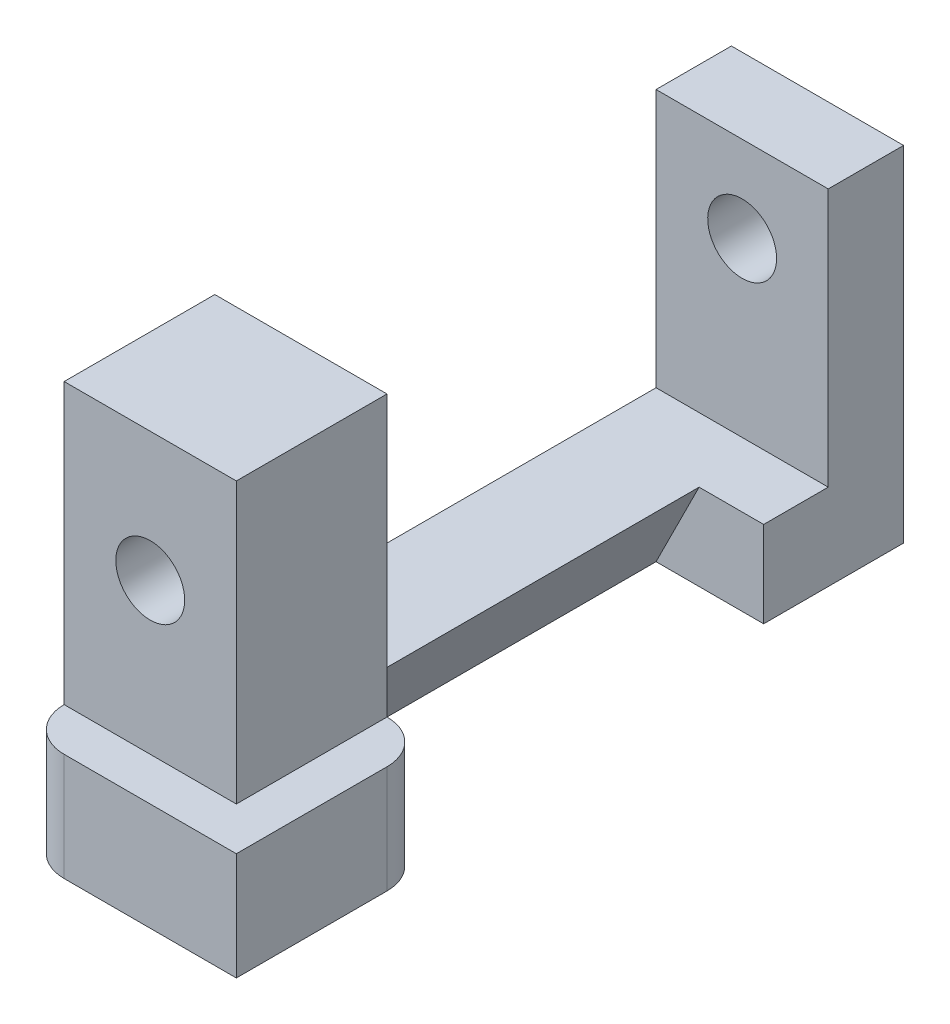
ISO-10303-21;
HEADER;
FILE_DESCRIPTION(('STEP AP214'),'2;1');
FILE_NAME('part.step','',(''),(''),'','','');
FILE_SCHEMA(('AUTOMOTIVE_DESIGN { 1 0 10303 214 1 1 1 1 }'));
ENDSEC;
DATA;
#1=APPLICATION_CONTEXT('core data for automotive mechanical design processes');
#2=APPLICATION_PROTOCOL_DEFINITION('international standard','automotive_design',2000,#1);
#3=PRODUCT_CONTEXT('',#1,'mechanical');
#4=PRODUCT('Part','Part','',(#3));
#5=PRODUCT_RELATED_PRODUCT_CATEGORY('part','',(#4));
#6=PRODUCT_DEFINITION_FORMATION('','',#4);
#7=PRODUCT_DEFINITION_CONTEXT('part definition',#1,'design');
#8=PRODUCT_DEFINITION('design','',#6,#7);
#9=PRODUCT_DEFINITION_SHAPE('','',#8);
#10=(LENGTH_UNIT() NAMED_UNIT(*) SI_UNIT(.MILLI.,.METRE.));
#11=(NAMED_UNIT(*) PLANE_ANGLE_UNIT() SI_UNIT($,.RADIAN.));
#12=(NAMED_UNIT(*) SI_UNIT($,.STERADIAN.) SOLID_ANGLE_UNIT());
#13=UNCERTAINTY_MEASURE_WITH_UNIT(LENGTH_MEASURE(1.E-05),#10,'distance_accuracy_value','');
#14=(GEOMETRIC_REPRESENTATION_CONTEXT(3) GLOBAL_UNCERTAINTY_ASSIGNED_CONTEXT((#13)) GLOBAL_UNIT_ASSIGNED_CONTEXT((#10,
#11,#12)) REPRESENTATION_CONTEXT('',''));
#15=CARTESIAN_POINT('',(0.,0.,0.));
#16=DIRECTION('',(0.,0.,1.));
#17=DIRECTION('',(1.,0.,0.));
#18=AXIS2_PLACEMENT_3D('',#15,#16,#17);
#19=CARTESIAN_POINT('',(-8.,18.,31.));
#20=DIRECTION('',(0.,0.,1.));
#21=DIRECTION('',(0.,-1.,0.));
#22=AXIS2_PLACEMENT_3D('',#19,#20,#21);
#23=PLANE('',#22);
#24=CARTESIAN_POINT('',(-12.,12.,31.));
#25=DIRECTION('',(0.,0.,1.));
#26=DIRECTION('',(1.,0.,0.));
#27=AXIS2_PLACEMENT_3D('',#24,#25,#26);
#28=CIRCLE('',#27,1.6);
#29=CARTESIAN_POINT('',(-10.4,12.,31.));
#30=VERTEX_POINT('',#29);
#31=EDGE_CURVE('E351',#30,#30,#28,.T.);
#32=ORIENTED_EDGE('',*,*,#31,.F.);
#33=EDGE_LOOP('',(#32));
#34=FACE_BOUND('',#33,.T.);
#35=DIRECTION('',(0.,-1.,0.));
#36=VECTOR('',#35,1.);
#37=CARTESIAN_POINT('',(-16.,18.,31.));
#38=LINE('',#37,#36);
#39=CARTESIAN_POINT('',(-16.,18.,31.));
#40=VERTEX_POINT('',#39);
#41=CARTESIAN_POINT('',(-16.,5.,31.));
#42=VERTEX_POINT('',#41);
#43=EDGE_CURVE('E167',#40,#42,#38,.T.);
#44=ORIENTED_EDGE('',*,*,#43,.T.);
#45=DIRECTION('',(1.,0.,0.));
#46=VECTOR('',#45,1.);
#47=CARTESIAN_POINT('',(-16.,5.,31.));
#48=LINE('',#47,#46);
#49=CARTESIAN_POINT('',(-8.,5.,31.));
#50=VERTEX_POINT('',#49);
#51=EDGE_CURVE('E140',#42,#50,#48,.T.);
#52=ORIENTED_EDGE('',*,*,#51,.T.);
#53=DIRECTION('',(0.,1.,0.));
#54=VECTOR('',#53,1.);
#55=CARTESIAN_POINT('',(-8.,18.,31.));
#56=LINE('',#55,#54);
#57=CARTESIAN_POINT('',(-8.,18.,31.));
#58=VERTEX_POINT('',#57);
#59=EDGE_CURVE('E247',#50,#58,#56,.T.);
#60=ORIENTED_EDGE('',*,*,#59,.T.);
#61=DIRECTION('',(1.,0.,0.));
#62=VECTOR('',#61,1.);
#63=CARTESIAN_POINT('',(-8.,18.,31.));
#64=LINE('',#63,#62);
#65=EDGE_CURVE('E41',#40,#58,#64,.T.);
#66=ORIENTED_EDGE('',*,*,#65,.F.);
#67=EDGE_LOOP('',(#44,#52,#60,#66));
#68=FACE_BOUND('',#67,.T.);
#69=ADVANCED_FACE('F33',(#34,#68),#23,.T.);
#70=CARTESIAN_POINT('',(-8.,0.,0.));
#71=DIRECTION('',(1.,0.,0.));
#72=DIRECTION('',(0.,0.,-1.));
#73=AXIS2_PLACEMENT_3D('',#70,#71,#72);
#74=PLANE('',#73);
#75=ORIENTED_EDGE('',*,*,#59,.F.);
#76=DIRECTION('',(0.,0.,-1.));
#77=VECTOR('',#76,1.);
#78=CARTESIAN_POINT('',(-8.,5.,31.));
#79=LINE('',#78,#77);
#80=CARTESIAN_POINT('',(-8.,5.,24.));
#81=VERTEX_POINT('',#80);
#82=EDGE_CURVE('E148',#50,#81,#79,.T.);
#83=ORIENTED_EDGE('',*,*,#82,.T.);
#84=DIRECTION('',(0.,-1.,0.));
#85=VECTOR('',#84,1.);
#86=CARTESIAN_POINT('',(-8.,4.,24.));
#87=LINE('',#86,#85);
#88=CARTESIAN_POINT('',(-8.,18.,24.));
#89=VERTEX_POINT('',#88);
#90=EDGE_CURVE('E241',#89,#81,#87,.T.);
#91=ORIENTED_EDGE('',*,*,#90,.F.);
#92=DIRECTION('',(0.,0.,-1.));
#93=VECTOR('',#92,1.);
#94=CARTESIAN_POINT('',(-8.,18.,24.));
#95=LINE('',#94,#93);
#96=EDGE_CURVE('E244',#58,#89,#95,.T.);
#97=ORIENTED_EDGE('',*,*,#96,.F.);
#98=EDGE_LOOP('',(#75,#83,#91,#97));
#99=FACE_BOUND('',#98,.T.);
#100=ADVANCED_FACE('F303',(#99),#74,.T.);
#101=CARTESIAN_POINT('',(-8.,16.,3.5));
#102=DIRECTION('',(0.,0.,1.));
#103=DIRECTION('',(0.,-1.,0.));
#104=AXIS2_PLACEMENT_3D('',#101,#102,#103);
#105=PLANE('',#104);
#106=CARTESIAN_POINT('',(-12.,12.,3.5));
#107=DIRECTION('',(0.,0.,1.));
#108=DIRECTION('',(0.,-1.,0.));
#109=AXIS2_PLACEMENT_3D('',#106,#107,#108);
#110=CIRCLE('',#109,1.6);
#111=CARTESIAN_POINT('',(-12.,10.4,3.5));
#112=VERTEX_POINT('',#111);
#113=EDGE_CURVE('E288',#112,#112,#110,.T.);
#114=ORIENTED_EDGE('',*,*,#113,.F.);
#115=EDGE_LOOP('',(#114));
#116=FACE_BOUND('',#115,.T.);
#117=DIRECTION('',(-1.,0.,0.));
#118=VECTOR('',#117,1.);
#119=CARTESIAN_POINT('',(-8.,4.,3.5));
#120=LINE('',#119,#118);
#121=CARTESIAN_POINT('',(-8.,4.,3.5));
#122=VERTEX_POINT('',#121);
#123=CARTESIAN_POINT('',(-16.,4.,3.5));
#124=VERTEX_POINT('',#123);
#125=EDGE_CURVE('E199',#122,#124,#120,.T.);
#126=ORIENTED_EDGE('',*,*,#125,.F.);
#127=DIRECTION('',(0.,1.,0.));
#128=VECTOR('',#127,1.);
#129=CARTESIAN_POINT('',(-8.,16.,3.5));
#130=LINE('',#129,#128);
#131=CARTESIAN_POINT('',(-8.,16.,3.5));
#132=VERTEX_POINT('',#131);
#133=EDGE_CURVE('E231',#122,#132,#130,.T.);
#134=ORIENTED_EDGE('',*,*,#133,.T.);
#135=DIRECTION('',(1.,0.,0.));
#136=VECTOR('',#135,1.);
#137=CARTESIAN_POINT('',(-8.,16.,3.5));
#138=LINE('',#137,#136);
#139=CARTESIAN_POINT('',(-16.,16.,3.5));
#140=VERTEX_POINT('',#139);
#141=EDGE_CURVE('E209',#140,#132,#138,.T.);
#142=ORIENTED_EDGE('',*,*,#141,.F.);
#143=DIRECTION('',(0.,-1.,0.));
#144=VECTOR('',#143,1.);
#145=CARTESIAN_POINT('',(-16.,16.,3.5));
#146=LINE('',#145,#144);
#147=EDGE_CURVE('E189',#140,#124,#146,.T.);
#148=ORIENTED_EDGE('',*,*,#147,.T.);
#149=EDGE_LOOP('',(#126,#134,#142,#148));
#150=FACE_BOUND('',#149,.T.);
#151=ADVANCED_FACE('F271',(#116,#150),#105,.T.);
#152=CARTESIAN_POINT('',(-13.,0.,30.4031242374328));
#153=DIRECTION('',(-0.894427190999916,0.447213595499958,0.));
#154=DIRECTION('',(-0.447213595499958,-0.894427190999916,0.));
#155=AXIS2_PLACEMENT_3D('',#152,#153,#154);
#156=PLANE('',#155);
#157=DIRECTION('',(-0.447213595499958,-0.894427190999916,0.));
#158=VECTOR('',#157,1.);
#159=CARTESIAN_POINT('',(-11.,4.,6.5));
#160=LINE('',#159,#158);
#161=CARTESIAN_POINT('',(-11.,4.,6.5));
#162=VERTEX_POINT('',#161);
#163=CARTESIAN_POINT('',(-13.,0.,6.5));
#164=VERTEX_POINT('',#163);
#165=EDGE_CURVE('E48',#162,#164,#160,.T.);
#166=ORIENTED_EDGE('',*,*,#165,.F.);
#167=DIRECTION('',(0.,0.,-1.));
#168=VECTOR('',#167,1.);
#169=CARTESIAN_POINT('',(-11.,4.,30.4031242374328));
#170=LINE('',#169,#168);
#171=CARTESIAN_POINT('',(-11.,4.,24.));
#172=VERTEX_POINT('',#171);
#173=EDGE_CURVE('E250',#172,#162,#170,.T.);
#174=ORIENTED_EDGE('',*,*,#173,.F.);
#175=DIRECTION('',(-0.447213595499958,-0.894427190999916,0.));
#176=VECTOR('',#175,1.);
#177=CARTESIAN_POINT('',(-13.,0.,24.));
#178=LINE('',#177,#176);
#179=CARTESIAN_POINT('',(-13.,0.,24.));
#180=VERTEX_POINT('',#179);
#181=EDGE_CURVE('E180',#172,#180,#178,.T.);
#182=ORIENTED_EDGE('',*,*,#181,.T.);
#183=DIRECTION('',(0.,0.,-1.));
#184=VECTOR('',#183,1.);
#185=CARTESIAN_POINT('',(-13.,0.,30.4031242374328));
#186=LINE('',#185,#184);
#187=EDGE_CURVE('E53',#180,#164,#186,.T.);
#188=ORIENTED_EDGE('',*,*,#187,.T.);
#189=EDGE_LOOP('',(#166,#174,#182,#188));
#190=FACE_BOUND('',#189,.T.);
#191=ADVANCED_FACE('F276',(#190),#156,.F.);
#192=CARTESIAN_POINT('',(-8.,0.,31.));
#193=DIRECTION('',(0.,-1.,0.));
#194=DIRECTION('',(0.,0.,-1.));
#195=AXIS2_PLACEMENT_3D('',#192,#193,#194);
#196=PLANE('',#195);
#197=DIRECTION('',(0.,0.,1.));
#198=VECTOR('',#197,1.);
#199=CARTESIAN_POINT('',(-8.,0.,31.));
#200=LINE('',#199,#198);
#201=CARTESIAN_POINT('',(-8.,0.,0.));
#202=VERTEX_POINT('',#201);
#203=CARTESIAN_POINT('',(-8.,0.,6.5));
#204=VERTEX_POINT('',#203);
#205=EDGE_CURVE('E217',#202,#204,#200,.T.);
#206=ORIENTED_EDGE('',*,*,#205,.T.);
#207=DIRECTION('',(1.,0.,0.));
#208=VECTOR('',#207,1.);
#209=CARTESIAN_POINT('',(-13.,0.,6.5));
#210=LINE('',#209,#208);
#211=EDGE_CURVE('E262',#164,#204,#210,.T.);
#212=ORIENTED_EDGE('',*,*,#211,.F.);
#213=ORIENTED_EDGE('',*,*,#187,.F.);
#214=DIRECTION('',(-1.,0.,0.));
#215=VECTOR('',#214,1.);
#216=CARTESIAN_POINT('',(-8.,0.,24.));
#217=LINE('',#216,#215);
#218=CARTESIAN_POINT('',(-8.,0.,24.));
#219=VERTEX_POINT('',#218);
#220=EDGE_CURVE('E201',#219,#180,#217,.T.);
#221=ORIENTED_EDGE('',*,*,#220,.F.);
#222=CARTESIAN_POINT('',(-8.,0.,26.));
#223=DIRECTION('',(0.,-1.,0.));
#224=DIRECTION('',(0.,0.,1.));
#225=AXIS2_PLACEMENT_3D('',#222,#223,#224);
#226=CIRCLE('',#225,2.);
#227=CARTESIAN_POINT('',(-6.,0.,26.));
#228=VERTEX_POINT('',#227);
#229=EDGE_CURVE('E279',#219,#228,#226,.T.);
#230=ORIENTED_EDGE('',*,*,#229,.T.);
#231=DIRECTION('',(0.,0.,1.));
#232=VECTOR('',#231,1.);
#233=CARTESIAN_POINT('',(-6.,0.,33.));
#234=LINE('',#233,#232);
#235=CARTESIAN_POINT('',(-6.,0.,33.));
#236=VERTEX_POINT('',#235);
#237=EDGE_CURVE('E282',#228,#236,#234,.T.);
#238=ORIENTED_EDGE('',*,*,#237,.T.);
#239=DIRECTION('',(-1.,0.,0.));
#240=VECTOR('',#239,1.);
#241=CARTESIAN_POINT('',(-14.,0.,33.));
#242=LINE('',#241,#240);
#243=CARTESIAN_POINT('',(-14.,0.,33.));
#244=VERTEX_POINT('',#243);
#245=EDGE_CURVE('E160',#236,#244,#242,.T.);
#246=ORIENTED_EDGE('',*,*,#245,.T.);
#247=CARTESIAN_POINT('',(-14.,0.,31.));
#248=DIRECTION('',(0.,-1.,0.));
#249=DIRECTION('',(0.,0.,-1.));
#250=AXIS2_PLACEMENT_3D('',#247,#248,#249);
#251=CIRCLE('',#250,2.);
#252=CARTESIAN_POINT('',(-16.,0.,31.));
#253=VERTEX_POINT('',#252);
#254=EDGE_CURVE('E285',#244,#253,#251,.T.);
#255=ORIENTED_EDGE('',*,*,#254,.T.);
#256=DIRECTION('',(0.,0.,-1.));
#257=VECTOR('',#256,1.);
#258=CARTESIAN_POINT('',(-16.,0.,31.));
#259=LINE('',#258,#257);
#260=CARTESIAN_POINT('',(-16.,0.,0.));
#261=VERTEX_POINT('',#260);
#262=EDGE_CURVE('E170',#253,#261,#259,.T.);
#263=ORIENTED_EDGE('',*,*,#262,.T.);
#264=DIRECTION('',(1.,0.,0.));
#265=VECTOR('',#264,1.);
#266=CARTESIAN_POINT('',(-8.,0.,0.));
#267=LINE('',#266,#265);
#268=EDGE_CURVE('E204',#261,#202,#267,.T.);
#269=ORIENTED_EDGE('',*,*,#268,.T.);
#270=EDGE_LOOP('',(#206,#212,#213,#221,#230,#238,#246,#255,#263,#269));
#271=FACE_BOUND('',#270,.T.);
#272=ADVANCED_FACE('F35',(#271),#196,.T.);
#273=CARTESIAN_POINT('',(-8.,18.,24.));
#274=DIRECTION('',(0.,1.,0.));
#275=DIRECTION('',(0.,0.,1.));
#276=AXIS2_PLACEMENT_3D('',#273,#274,#275);
#277=PLANE('',#276);
#278=ORIENTED_EDGE('',*,*,#65,.T.);
#279=ORIENTED_EDGE('',*,*,#96,.T.);
#280=DIRECTION('',(1.,0.,0.));
#281=VECTOR('',#280,1.);
#282=CARTESIAN_POINT('',(-8.,18.,24.));
#283=LINE('',#282,#281);
#284=CARTESIAN_POINT('',(-16.,18.,24.));
#285=VERTEX_POINT('',#284);
#286=EDGE_CURVE('E206',#285,#89,#283,.T.);
#287=ORIENTED_EDGE('',*,*,#286,.F.);
#288=DIRECTION('',(0.,0.,1.));
#289=VECTOR('',#288,1.);
#290=CARTESIAN_POINT('',(-16.,18.,24.));
#291=LINE('',#290,#289);
#292=EDGE_CURVE('E176',#285,#40,#291,.T.);
#293=ORIENTED_EDGE('',*,*,#292,.T.);
#294=EDGE_LOOP('',(#278,#279,#287,#293));
#295=FACE_BOUND('',#294,.T.);
#296=ADVANCED_FACE('F330',(#295),#277,.T.);
#297=CARTESIAN_POINT('',(-8.,4.,24.));
#298=DIRECTION('',(0.,0.,-1.));
#299=DIRECTION('',(-1.,0.,0.));
#300=AXIS2_PLACEMENT_3D('',#297,#298,#299);
#301=PLANE('',#300);
#302=CARTESIAN_POINT('',(-12.,12.,24.));
#303=DIRECTION('',(0.,0.,-1.));
#304=DIRECTION('',(-1.,0.,0.));
#305=AXIS2_PLACEMENT_3D('',#302,#303,#304);
#306=CIRCLE('',#305,1.6);
#307=CARTESIAN_POINT('',(-13.6,12.,24.));
#308=VERTEX_POINT('',#307);
#309=EDGE_CURVE('E350',#308,#308,#306,.T.);
#310=ORIENTED_EDGE('',*,*,#309,.F.);
#311=EDGE_LOOP('',(#310));
#312=FACE_BOUND('',#311,.T.);
#313=ORIENTED_EDGE('',*,*,#286,.T.);
#314=ORIENTED_EDGE('',*,*,#90,.T.);
#315=DIRECTION('',(0.,-1.,0.));
#316=VECTOR('',#315,1.);
#317=CARTESIAN_POINT('',(-8.,5.,24.));
#318=LINE('',#317,#316);
#319=EDGE_CURVE('E171',#81,#219,#318,.T.);
#320=ORIENTED_EDGE('',*,*,#319,.T.);
#321=ORIENTED_EDGE('',*,*,#220,.T.);
#322=ORIENTED_EDGE('',*,*,#181,.F.);
#323=DIRECTION('',(-1.,0.,0.));
#324=VECTOR('',#323,1.);
#325=CARTESIAN_POINT('',(-8.,4.,24.));
#326=LINE('',#325,#324);
#327=CARTESIAN_POINT('',(-16.,4.,24.));
#328=VERTEX_POINT('',#327);
#329=EDGE_CURVE('E198',#172,#328,#326,.T.);
#330=ORIENTED_EDGE('',*,*,#329,.T.);
#331=DIRECTION('',(0.,1.,0.));
#332=VECTOR('',#331,1.);
#333=CARTESIAN_POINT('',(-16.,4.,24.));
#334=LINE('',#333,#332);
#335=EDGE_CURVE('E178',#328,#285,#334,.T.);
#336=ORIENTED_EDGE('',*,*,#335,.T.);
#337=EDGE_LOOP('',(#313,#314,#320,#321,#322,#330,#336));
#338=FACE_BOUND('',#337,.T.);
#339=ADVANCED_FACE('F273',(#312,#338),#301,.T.);
#340=CARTESIAN_POINT('',(-8.,16.,0.));
#341=DIRECTION('',(0.,1.,0.));
#342=DIRECTION('',(0.,0.,1.));
#343=AXIS2_PLACEMENT_3D('',#340,#341,#342);
#344=PLANE('',#343);
#345=ORIENTED_EDGE('',*,*,#141,.T.);
#346=DIRECTION('',(0.,0.,-1.));
#347=VECTOR('',#346,1.);
#348=CARTESIAN_POINT('',(-8.,16.,0.));
#349=LINE('',#348,#347);
#350=CARTESIAN_POINT('',(-8.,16.,0.));
#351=VERTEX_POINT('',#350);
#352=EDGE_CURVE('E228',#132,#351,#349,.T.);
#353=ORIENTED_EDGE('',*,*,#352,.T.);
#354=DIRECTION('',(1.,0.,0.));
#355=VECTOR('',#354,1.);
#356=CARTESIAN_POINT('',(-8.,16.,0.));
#357=LINE('',#356,#355);
#358=CARTESIAN_POINT('',(-16.,16.,0.));
#359=VERTEX_POINT('',#358);
#360=EDGE_CURVE('E212',#359,#351,#357,.T.);
#361=ORIENTED_EDGE('',*,*,#360,.F.);
#362=DIRECTION('',(0.,0.,1.));
#363=VECTOR('',#362,1.);
#364=CARTESIAN_POINT('',(-16.,16.,0.));
#365=LINE('',#364,#363);
#366=EDGE_CURVE('E192',#359,#140,#365,.T.);
#367=ORIENTED_EDGE('',*,*,#366,.T.);
#368=EDGE_LOOP('',(#345,#353,#361,#367));
#369=FACE_BOUND('',#368,.T.);
#370=ADVANCED_FACE('F225',(#369),#344,.T.);
#371=CARTESIAN_POINT('',(-8.,0.,0.));
#372=DIRECTION('',(0.,0.,-1.));
#373=DIRECTION('',(-1.,0.,0.));
#374=AXIS2_PLACEMENT_3D('',#371,#372,#373);
#375=PLANE('',#374);
#376=CARTESIAN_POINT('',(-12.,12.,0.));
#377=DIRECTION('',(0.,0.,1.));
#378=DIRECTION('',(1.,0.,0.));
#379=AXIS2_PLACEMENT_3D('',#376,#377,#378);
#380=CIRCLE('',#379,1.6);
#381=CARTESIAN_POINT('',(-10.4,12.,0.));
#382=VERTEX_POINT('',#381);
#383=EDGE_CURVE('E348',#382,#382,#380,.T.);
#384=ORIENTED_EDGE('',*,*,#383,.T.);
#385=EDGE_LOOP('',(#384));
#386=FACE_BOUND('',#385,.T.);
#387=ORIENTED_EDGE('',*,*,#360,.T.);
#388=DIRECTION('',(0.,-1.,0.));
#389=VECTOR('',#388,1.);
#390=CARTESIAN_POINT('',(-8.,0.,0.));
#391=LINE('',#390,#389);
#392=EDGE_CURVE('E11',#351,#202,#391,.T.);
#393=ORIENTED_EDGE('',*,*,#392,.T.);
#394=ORIENTED_EDGE('',*,*,#268,.F.);
#395=DIRECTION('',(0.,1.,0.));
#396=VECTOR('',#395,1.);
#397=CARTESIAN_POINT('',(-16.,0.,0.));
#398=LINE('',#397,#396);
#399=EDGE_CURVE('E195',#261,#359,#398,.T.);
#400=ORIENTED_EDGE('',*,*,#399,.T.);
#401=EDGE_LOOP('',(#387,#393,#394,#400));
#402=FACE_BOUND('',#401,.T.);
#403=ADVANCED_FACE('F220',(#386,#402),#375,.T.);
#404=CARTESIAN_POINT('',(-8.,4.,3.5));
#405=DIRECTION('',(0.,-1.,0.));
#406=DIRECTION('',(0.,0.,-1.));
#407=AXIS2_PLACEMENT_3D('',#404,#405,#406);
#408=PLANE('',#407);
#409=ORIENTED_EDGE('',*,*,#329,.F.);
#410=ORIENTED_EDGE('',*,*,#173,.T.);
#411=DIRECTION('',(-1.,0.,0.));
#412=VECTOR('',#411,1.);
#413=CARTESIAN_POINT('',(-8.,4.,6.5));
#414=LINE('',#413,#412);
#415=CARTESIAN_POINT('',(-8.,4.,6.5));
#416=VERTEX_POINT('',#415);
#417=EDGE_CURVE('E256',#416,#162,#414,.T.);
#418=ORIENTED_EDGE('',*,*,#417,.F.);
#419=DIRECTION('',(0.,0.,-1.));
#420=VECTOR('',#419,1.);
#421=CARTESIAN_POINT('',(-8.,4.,6.5));
#422=LINE('',#421,#420);
#423=EDGE_CURVE('E232',#416,#122,#422,.T.);
#424=ORIENTED_EDGE('',*,*,#423,.T.);
#425=ORIENTED_EDGE('',*,*,#125,.T.);
#426=DIRECTION('',(0.,0.,1.));
#427=VECTOR('',#426,1.);
#428=CARTESIAN_POINT('',(-16.,4.,3.5));
#429=LINE('',#428,#427);
#430=EDGE_CURVE('E186',#124,#328,#429,.T.);
#431=ORIENTED_EDGE('',*,*,#430,.T.);
#432=EDGE_LOOP('',(#409,#410,#418,#424,#425,#431));
#433=FACE_BOUND('',#432,.T.);
#434=ADVANCED_FACE('F255',(#433),#408,.F.);
#435=CARTESIAN_POINT('',(-16.,0.,0.));
#436=DIRECTION('',(-1.,0.,0.));
#437=DIRECTION('',(0.,0.,-1.));
#438=AXIS2_PLACEMENT_3D('',#435,#436,#437);
#439=PLANE('',#438);
#440=ORIENTED_EDGE('',*,*,#262,.F.);
#441=DIRECTION('',(0.,-1.,0.));
#442=VECTOR('',#441,1.);
#443=CARTESIAN_POINT('',(-16.,5.,31.));
#444=LINE('',#443,#442);
#445=EDGE_CURVE('E157',#42,#253,#444,.T.);
#446=ORIENTED_EDGE('',*,*,#445,.F.);
#447=ORIENTED_EDGE('',*,*,#43,.F.);
#448=ORIENTED_EDGE('',*,*,#292,.F.);
#449=ORIENTED_EDGE('',*,*,#335,.F.);
#450=ORIENTED_EDGE('',*,*,#430,.F.);
#451=ORIENTED_EDGE('',*,*,#147,.F.);
#452=ORIENTED_EDGE('',*,*,#366,.F.);
#453=ORIENTED_EDGE('',*,*,#399,.F.);
#454=EDGE_LOOP('',(#440,#446,#447,#448,#449,#450,#451,#452,#453));
#455=FACE_BOUND('',#454,.T.);
#456=ADVANCED_FACE('F165',(#455),#439,.T.);
#457=ORIENTED_EDGE('',*,*,#392,.F.);
#458=ORIENTED_EDGE('',*,*,#352,.F.);
#459=ORIENTED_EDGE('',*,*,#133,.F.);
#460=ORIENTED_EDGE('',*,*,#423,.F.);
#461=DIRECTION('',(0.,1.,0.));
#462=VECTOR('',#461,1.);
#463=CARTESIAN_POINT('',(-8.,0.,6.5));
#464=LINE('',#463,#462);
#465=EDGE_CURVE('E236',#204,#416,#464,.T.);
#466=ORIENTED_EDGE('',*,*,#465,.F.);
#467=ORIENTED_EDGE('',*,*,#205,.F.);
#468=EDGE_LOOP('',(#457,#458,#459,#460,#466,#467));
#469=FACE_BOUND('',#468,.T.);
#470=ADVANCED_FACE('F268',(#469),#74,.T.);
#471=CARTESIAN_POINT('',(0.,0.,6.5));
#472=DIRECTION('',(0.,0.,-1.));
#473=DIRECTION('',(-1.,0.,0.));
#474=AXIS2_PLACEMENT_3D('',#471,#472,#473);
#475=PLANE('',#474);
#476=ORIENTED_EDGE('',*,*,#417,.T.);
#477=ORIENTED_EDGE('',*,*,#165,.T.);
#478=ORIENTED_EDGE('',*,*,#211,.T.);
#479=ORIENTED_EDGE('',*,*,#465,.T.);
#480=EDGE_LOOP('',(#476,#477,#478,#479));
#481=FACE_BOUND('',#480,.T.);
#482=ADVANCED_FACE('F258',(#481),#475,.F.);
#483=CARTESIAN_POINT('',(-14.,5.,31.));
#484=DIRECTION('',(0.,-1.,0.));
#485=DIRECTION('',(0.,0.,-1.));
#486=AXIS2_PLACEMENT_3D('',#483,#484,#485);
#487=CYLINDRICAL_SURFACE('',#486,2.);
#488=ORIENTED_EDGE('',*,*,#254,.F.);
#489=DIRECTION('',(0.,-1.,0.));
#490=VECTOR('',#489,1.);
#491=CARTESIAN_POINT('',(-14.,5.,33.));
#492=LINE('',#491,#490);
#493=CARTESIAN_POINT('',(-14.,5.,33.));
#494=VERTEX_POINT('',#493);
#495=EDGE_CURVE('E159',#494,#244,#492,.T.);
#496=ORIENTED_EDGE('',*,*,#495,.F.);
#497=CARTESIAN_POINT('',(-14.,5.,31.));
#498=DIRECTION('',(0.,-1.,0.));
#499=DIRECTION('',(0.,0.,-1.));
#500=AXIS2_PLACEMENT_3D('',#497,#498,#499);
#501=CIRCLE('',#500,2.);
#502=EDGE_CURVE('E144',#494,#42,#501,.T.);
#503=ORIENTED_EDGE('',*,*,#502,.T.);
#504=ORIENTED_EDGE('',*,*,#445,.T.);
#505=EDGE_LOOP('',(#488,#496,#503,#504));
#506=FACE_BOUND('',#505,.T.);
#507=ADVANCED_FACE('F156',(#506),#487,.T.);
#508=CARTESIAN_POINT('',(-14.,5.,33.));
#509=DIRECTION('',(0.,0.,1.));
#510=DIRECTION('',(1.,0.,0.));
#511=AXIS2_PLACEMENT_3D('',#508,#509,#510);
#512=PLANE('',#511);
#513=ORIENTED_EDGE('',*,*,#245,.F.);
#514=DIRECTION('',(0.,-1.,0.));
#515=VECTOR('',#514,1.);
#516=CARTESIAN_POINT('',(-6.,5.,33.));
#517=LINE('',#516,#515);
#518=CARTESIAN_POINT('',(-6.,5.,33.));
#519=VERTEX_POINT('',#518);
#520=EDGE_CURVE('E264',#519,#236,#517,.T.);
#521=ORIENTED_EDGE('',*,*,#520,.F.);
#522=DIRECTION('',(-1.,0.,0.));
#523=VECTOR('',#522,1.);
#524=CARTESIAN_POINT('',(-14.,5.,33.));
#525=LINE('',#524,#523);
#526=EDGE_CURVE('E172',#519,#494,#525,.T.);
#527=ORIENTED_EDGE('',*,*,#526,.T.);
#528=ORIENTED_EDGE('',*,*,#495,.T.);
#529=EDGE_LOOP('',(#513,#521,#527,#528));
#530=FACE_BOUND('',#529,.T.);
#531=ADVANCED_FACE('F308',(#530),#512,.T.);
#532=CARTESIAN_POINT('',(-6.,5.,33.));
#533=DIRECTION('',(1.,0.,0.));
#534=DIRECTION('',(0.,0.,-1.));
#535=AXIS2_PLACEMENT_3D('',#532,#533,#534);
#536=PLANE('',#535);
#537=ORIENTED_EDGE('',*,*,#237,.F.);
#538=DIRECTION('',(0.,-1.,0.));
#539=VECTOR('',#538,1.);
#540=CARTESIAN_POINT('',(-6.,5.,26.));
#541=LINE('',#540,#539);
#542=CARTESIAN_POINT('',(-6.,5.,26.));
#543=VERTEX_POINT('',#542);
#544=EDGE_CURVE('E294',#543,#228,#541,.T.);
#545=ORIENTED_EDGE('',*,*,#544,.F.);
#546=DIRECTION('',(0.,0.,1.));
#547=VECTOR('',#546,1.);
#548=CARTESIAN_POINT('',(-6.,5.,33.));
#549=LINE('',#548,#547);
#550=EDGE_CURVE('E300',#543,#519,#549,.T.);
#551=ORIENTED_EDGE('',*,*,#550,.T.);
#552=ORIENTED_EDGE('',*,*,#520,.T.);
#553=EDGE_LOOP('',(#537,#545,#551,#552));
#554=FACE_BOUND('',#553,.T.);
#555=ADVANCED_FACE('F310',(#554),#536,.T.);
#556=CARTESIAN_POINT('',(-8.,5.,26.));
#557=DIRECTION('',(0.,-1.,0.));
#558=DIRECTION('',(0.,0.,-1.));
#559=AXIS2_PLACEMENT_3D('',#556,#557,#558);
#560=CYLINDRICAL_SURFACE('',#559,2.);
#561=ORIENTED_EDGE('',*,*,#229,.F.);
#562=ORIENTED_EDGE('',*,*,#319,.F.);
#563=CARTESIAN_POINT('',(-8.,5.,26.));
#564=DIRECTION('',(0.,-1.,0.));
#565=DIRECTION('',(0.,0.,1.));
#566=AXIS2_PLACEMENT_3D('',#563,#564,#565);
#567=CIRCLE('',#566,2.);
#568=EDGE_CURVE('E297',#81,#543,#567,.T.);
#569=ORIENTED_EDGE('',*,*,#568,.T.);
#570=ORIENTED_EDGE('',*,*,#544,.T.);
#571=EDGE_LOOP('',(#561,#562,#569,#570));
#572=FACE_BOUND('',#571,.T.);
#573=ADVANCED_FACE('F296',(#572),#560,.T.);
#574=CARTESIAN_POINT('',(-14.,5.,31.));
#575=DIRECTION('',(0.,-1.,0.));
#576=DIRECTION('',(0.,0.,-1.));
#577=AXIS2_PLACEMENT_3D('',#574,#575,#576);
#578=PLANE('',#577);
#579=ORIENTED_EDGE('',*,*,#502,.F.);
#580=ORIENTED_EDGE('',*,*,#526,.F.);
#581=ORIENTED_EDGE('',*,*,#550,.F.);
#582=ORIENTED_EDGE('',*,*,#568,.F.);
#583=ORIENTED_EDGE('',*,*,#82,.F.);
#584=ORIENTED_EDGE('',*,*,#51,.F.);
#585=EDGE_LOOP('',(#579,#580,#581,#582,#583,#584));
#586=FACE_BOUND('',#585,.T.);
#587=ADVANCED_FACE('F142',(#586),#578,.F.);
#588=CARTESIAN_POINT('',(-12.,12.,0.));
#589=DIRECTION('',(0.,0.,1.));
#590=DIRECTION('',(1.,0.,0.));
#591=AXIS2_PLACEMENT_3D('',#588,#589,#590);
#592=CYLINDRICAL_SURFACE('',#591,1.6);
#593=ORIENTED_EDGE('',*,*,#113,.T.);
#594=EDGE_LOOP('',(#593));
#595=FACE_BOUND('',#594,.T.);
#596=ORIENTED_EDGE('',*,*,#383,.F.);
#597=EDGE_LOOP('',(#596));
#598=FACE_BOUND('',#597,.T.);
#599=ADVANCED_FACE('F361',(#595,#598),#592,.F.);
#600=ORIENTED_EDGE('',*,*,#309,.T.);
#601=EDGE_LOOP('',(#600));
#602=FACE_BOUND('',#601,.T.);
#603=ORIENTED_EDGE('',*,*,#31,.T.);
#604=EDGE_LOOP('',(#603));
#605=FACE_BOUND('',#604,.T.);
#606=ADVANCED_FACE('F363',(#602,#605),#592,.F.);
#607=CLOSED_SHELL('',(#69,#100,#151,#191,#272,#296,#339,#370,#403,#434,#456,#470,#482,#507,#531,
#555,#573,#587,#599,#606));
#608=MANIFOLD_SOLID_BREP('B2',#607);
#609=ADVANCED_BREP_SHAPE_REPRESENTATION('',(#18,#608),#14);
#610=SHAPE_DEFINITION_REPRESENTATION(#9,#609);
ENDSEC;
END-ISO-10303-21;
